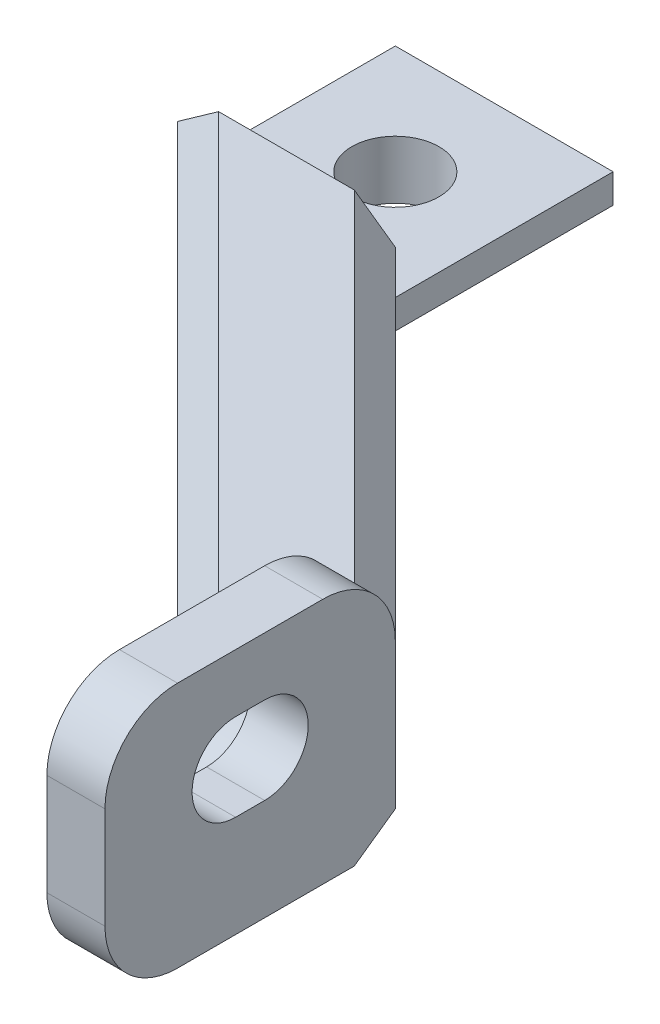
ISO-10303-21;
HEADER;
FILE_DESCRIPTION(('STEP AP214'),'2;1');
FILE_NAME('part.step','',(''),(''),'','','');
FILE_SCHEMA(('AUTOMOTIVE_DESIGN { 1 0 10303 214 1 1 1 1 }'));
ENDSEC;
DATA;
#1=APPLICATION_CONTEXT('core data for automotive mechanical design processes');
#2=APPLICATION_PROTOCOL_DEFINITION('international standard','automotive_design',2000,#1);
#3=PRODUCT_CONTEXT('',#1,'mechanical');
#4=PRODUCT('Part','Part','',(#3));
#5=PRODUCT_RELATED_PRODUCT_CATEGORY('part','',(#4));
#6=PRODUCT_DEFINITION_FORMATION('','',#4);
#7=PRODUCT_DEFINITION_CONTEXT('part definition',#1,'design');
#8=PRODUCT_DEFINITION('design','',#6,#7);
#9=PRODUCT_DEFINITION_SHAPE('','',#8);
#10=(LENGTH_UNIT() NAMED_UNIT(*) SI_UNIT(.MILLI.,.METRE.));
#11=(NAMED_UNIT(*) PLANE_ANGLE_UNIT() SI_UNIT($,.RADIAN.));
#12=(NAMED_UNIT(*) SI_UNIT($,.STERADIAN.) SOLID_ANGLE_UNIT());
#13=UNCERTAINTY_MEASURE_WITH_UNIT(LENGTH_MEASURE(1.E-05),#10,'distance_accuracy_value','');
#14=(GEOMETRIC_REPRESENTATION_CONTEXT(3) GLOBAL_UNCERTAINTY_ASSIGNED_CONTEXT((#13)) GLOBAL_UNIT_ASSIGNED_CONTEXT((#10,
#11,#12)) REPRESENTATION_CONTEXT('',''));
#15=CARTESIAN_POINT('',(0.,0.,0.));
#16=DIRECTION('',(0.,0.,1.));
#17=DIRECTION('',(1.,0.,0.));
#18=AXIS2_PLACEMENT_3D('',#15,#16,#17);
#19=CARTESIAN_POINT('',(-7.5,9.,7.5));
#20=DIRECTION('',(0.707106781186546,0.,-0.707106781186549));
#21=DIRECTION('',(-0.707106781186549,0.,-0.707106781186546));
#22=AXIS2_PLACEMENT_3D('',#19,#20,#21);
#23=PLANE('',#22);
#24=DIRECTION('',(0.,-1.,0.));
#25=VECTOR('',#24,1.);
#26=CARTESIAN_POINT('',(-7.5,9.,7.5));
#27=LINE('',#26,#25);
#28=CARTESIAN_POINT('',(-7.50000000000001,4.,7.5));
#29=VERTEX_POINT('',#28);
#30=CARTESIAN_POINT('',(-7.5,2.00000000000001,7.5));
#31=VERTEX_POINT('',#30);
#32=EDGE_CURVE('E288',#29,#31,#27,.T.);
#33=ORIENTED_EDGE('',*,*,#32,.T.);
#34=DIRECTION('',(0.707106781186549,0.,0.707106781186546));
#35=VECTOR('',#34,1.);
#36=CARTESIAN_POINT('',(-7.5,2.,7.5));
#37=LINE('',#36,#35);
#38=CARTESIAN_POINT('',(32.,2.,46.9999999999999));
#39=VERTEX_POINT('',#38);
#40=EDGE_CURVE('E352',#31,#39,#37,.T.);
#41=ORIENTED_EDGE('',*,*,#40,.T.);
#42=DIRECTION('',(0.,1.,0.));
#43=VECTOR('',#42,1.);
#44=CARTESIAN_POINT('',(32.,9.,46.9999999999999));
#45=LINE('',#44,#43);
#46=CARTESIAN_POINT('',(32.,5.,46.9999999999999));
#47=VERTEX_POINT('',#46);
#48=EDGE_CURVE('E275',#39,#47,#45,.T.);
#49=ORIENTED_EDGE('',*,*,#48,.T.);
#50=DIRECTION('',(0.707106781186549,0.,0.707106781186546));
#51=VECTOR('',#50,1.);
#52=CARTESIAN_POINT('',(-7.5,5.,7.5));
#53=LINE('',#52,#51);
#54=CARTESIAN_POINT('',(30.0000000000001,5.,44.9999999999999));
#55=VERTEX_POINT('',#54);
#56=EDGE_CURVE('E403',#55,#47,#53,.T.);
#57=ORIENTED_EDGE('',*,*,#56,.F.);
#58=CARTESIAN_POINT('',(30.,10.,44.9999999999999));
#59=DIRECTION('',(0.707106781186546,0.,-0.707106781186549));
#60=DIRECTION('',(0.707106781186549,0.,0.707106781186546));
#61=AXIS2_PLACEMENT_3D('',#58,#59,#60);
#62=ELLIPSE('',#61,7.07106781186549,5.);
#63=CARTESIAN_POINT('',(26.,7.,40.9999999999999));
#64=VERTEX_POINT('',#63);
#65=EDGE_CURVE('E410',#64,#55,#62,.F.);
#66=ORIENTED_EDGE('',*,*,#65,.F.);
#67=DIRECTION('',(-0.707106781186549,0.,-0.707106781186546));
#68=VECTOR('',#67,1.);
#69=CARTESIAN_POINT('',(-7.5,7.,7.5));
#70=LINE('',#69,#68);
#71=CARTESIAN_POINT('',(-7.5,7.,7.5));
#72=VERTEX_POINT('',#71);
#73=EDGE_CURVE('E350',#64,#72,#70,.T.);
#74=ORIENTED_EDGE('',*,*,#73,.T.);
#75=EDGE_CURVE('E289',#72,#29,#27,.T.);
#76=ORIENTED_EDGE('',*,*,#75,.T.);
#77=EDGE_LOOP('',(#33,#41,#49,#57,#66,#74,#76));
#78=FACE_BOUND('',#77,.T.);
#79=ADVANCED_FACE('F36',(#78),#23,.F.);
#80=CARTESIAN_POINT('',(7.5,9.,-7.5));
#81=DIRECTION('',(0.,1.,0.));
#82=DIRECTION('',(0.,0.,1.));
#83=AXIS2_PLACEMENT_3D('',#80,#81,#82);
#84=PLANE('',#83);
#85=DIRECTION('',(1.,0.,0.));
#86=VECTOR('',#85,1.);
#87=CARTESIAN_POINT('',(-7.50000000000001,9.,7.5));
#88=LINE('',#87,#86);
#89=CARTESIAN_POINT('',(-4.67157287525382,9.,7.5));
#90=VERTEX_POINT('',#89);
#91=CARTESIAN_POINT('',(4.67157287525381,9.,7.5));
#92=VERTEX_POINT('',#91);
#93=EDGE_CURVE('E244',#90,#92,#88,.T.);
#94=ORIENTED_EDGE('',*,*,#93,.F.);
#95=DIRECTION('',(0.707106781186549,0.,0.707106781186546));
#96=VECTOR('',#95,1.);
#97=CARTESIAN_POINT('',(26.5152340768067,9.,38.6868069520604));
#98=LINE('',#97,#96);
#99=CARTESIAN_POINT('',(27.9294476391799,9.,40.1010205144335));
#100=VERTEX_POINT('',#99);
#101=EDGE_CURVE('E356',#90,#100,#98,.T.);
#102=ORIENTED_EDGE('',*,*,#101,.T.);
#103=DIRECTION('',(1.,0.,0.));
#104=VECTOR('',#103,1.);
#105=CARTESIAN_POINT('',(-7.50000000000002,9.,40.1010205144335));
#106=LINE('',#105,#104);
#107=CARTESIAN_POINT('',(32.,9.,40.1010205144335));
#108=VERTEX_POINT('',#107);
#109=EDGE_CURVE('E408',#100,#108,#106,.T.);
#110=ORIENTED_EDGE('',*,*,#109,.T.);
#111=DIRECTION('',(0.,0.,1.));
#112=VECTOR('',#111,1.);
#113=CARTESIAN_POINT('',(32.,9.,-7.5));
#114=LINE('',#113,#112);
#115=CARTESIAN_POINT('',(32.,9.,35.9999999999999));
#116=VERTEX_POINT('',#115);
#117=EDGE_CURVE('E264',#116,#108,#114,.T.);
#118=ORIENTED_EDGE('',*,*,#117,.F.);
#119=DIRECTION('',(-1.,0.,0.));
#120=VECTOR('',#119,1.);
#121=CARTESIAN_POINT('',(7.5,9.,35.9999999999999));
#122=LINE('',#121,#120);
#123=CARTESIAN_POINT('',(33.1715728752538,9.,35.9999999999999));
#124=VERTEX_POINT('',#123);
#125=EDGE_CURVE('E277',#124,#116,#122,.T.);
#126=ORIENTED_EDGE('',*,*,#125,.F.);
#127=DIRECTION('',(-0.707106781186549,0.,-0.707106781186546));
#128=VECTOR('',#127,1.);
#129=CARTESIAN_POINT('',(6.08578643762691,9.,8.9142135623731));
#130=LINE('',#129,#128);
#131=EDGE_CURVE('E354',#124,#92,#130,.T.);
#132=ORIENTED_EDGE('',*,*,#131,.T.);
#133=EDGE_LOOP('',(#94,#102,#110,#118,#126,#132));
#134=FACE_BOUND('',#133,.T.);
#135=ADVANCED_FACE('F441',(#134),#84,.T.);
#136=CARTESIAN_POINT('',(-7.50000000000002,10.,44.9999999999999));
#137=DIRECTION('',(1.,0.,0.));
#138=DIRECTION('',(0.,0.,-1.));
#139=AXIS2_PLACEMENT_3D('',#136,#137,#138);
#140=CYLINDRICAL_SURFACE('',#139,3.);
#141=CARTESIAN_POINT('',(32.,10.,44.9999999999999));
#142=DIRECTION('',(-1.,0.,0.));
#143=DIRECTION('',(0.,0.,1.));
#144=AXIS2_PLACEMENT_3D('',#141,#142,#143);
#145=CIRCLE('',#144,3.);
#146=CARTESIAN_POINT('',(32.,13.,44.9999999999999));
#147=VERTEX_POINT('',#146);
#148=CARTESIAN_POINT('',(32.,7.00000000000001,44.9999999999999));
#149=VERTEX_POINT('',#148);
#150=EDGE_CURVE('E197',#147,#149,#145,.T.);
#151=ORIENTED_EDGE('',*,*,#150,.T.);
#152=DIRECTION('',(1.,0.,0.));
#153=VECTOR('',#152,1.);
#154=CARTESIAN_POINT('',(-7.50000000000002,7.00000000000001,44.9999999999999));
#155=LINE('',#154,#153);
#156=CARTESIAN_POINT('',(36.,7.00000000000001,44.9999999999999));
#157=VERTEX_POINT('',#156);
#158=EDGE_CURVE('E201',#149,#157,#155,.T.);
#159=ORIENTED_EDGE('',*,*,#158,.T.);
#160=CARTESIAN_POINT('',(36.,10.,44.9999999999999));
#161=DIRECTION('',(1.,0.,0.));
#162=DIRECTION('',(0.,0.,-1.));
#163=AXIS2_PLACEMENT_3D('',#160,#161,#162);
#164=CIRCLE('',#163,3.);
#165=CARTESIAN_POINT('',(36.,13.,44.9999999999999));
#166=VERTEX_POINT('',#165);
#167=EDGE_CURVE('E412',#157,#166,#164,.T.);
#168=ORIENTED_EDGE('',*,*,#167,.T.);
#169=DIRECTION('',(1.,0.,0.));
#170=VECTOR('',#169,1.);
#171=CARTESIAN_POINT('',(-7.50000000000002,13.,44.9999999999999));
#172=LINE('',#171,#170);
#173=EDGE_CURVE('E204',#147,#166,#172,.T.);
#174=ORIENTED_EDGE('',*,*,#173,.F.);
#175=EDGE_LOOP('',(#151,#159,#168,#174));
#176=FACE_BOUND('',#175,.T.);
#177=ADVANCED_FACE('F199',(#176),#140,.F.);
#178=CARTESIAN_POINT('',(-7.50000000000002,7.00000000000001,44.9999999999999));
#179=DIRECTION('',(0.,-1.,0.));
#180=DIRECTION('',(0.,0.,-1.));
#181=AXIS2_PLACEMENT_3D('',#178,#179,#180);
#182=PLANE('',#181);
#183=DIRECTION('',(0.,0.,1.));
#184=VECTOR('',#183,1.);
#185=CARTESIAN_POINT('',(32.,7.00000000000001,46.9999999999999));
#186=LINE('',#185,#184);
#187=CARTESIAN_POINT('',(32.,7.00000000000001,46.9999999999999));
#188=VERTEX_POINT('',#187);
#189=EDGE_CURVE('E211',#149,#188,#186,.T.);
#190=ORIENTED_EDGE('',*,*,#189,.T.);
#191=DIRECTION('',(1.,0.,0.));
#192=VECTOR('',#191,1.);
#193=CARTESIAN_POINT('',(-7.50000000000002,7.00000000000001,46.9999999999999));
#194=LINE('',#193,#192);
#195=CARTESIAN_POINT('',(36.,7.00000000000001,46.9999999999999));
#196=VERTEX_POINT('',#195);
#197=EDGE_CURVE('E224',#188,#196,#194,.T.);
#198=ORIENTED_EDGE('',*,*,#197,.T.);
#199=DIRECTION('',(0.,0.,-1.));
#200=VECTOR('',#199,1.);
#201=CARTESIAN_POINT('',(36.,7.00000000000001,44.9999999999999));
#202=LINE('',#201,#200);
#203=EDGE_CURVE('E221',#196,#157,#202,.T.);
#204=ORIENTED_EDGE('',*,*,#203,.T.);
#205=ORIENTED_EDGE('',*,*,#158,.F.);
#206=EDGE_LOOP('',(#190,#198,#204,#205));
#207=FACE_BOUND('',#206,.T.);
#208=ADVANCED_FACE('F219',(#207),#182,.F.);
#209=CARTESIAN_POINT('',(7.5,9.,-7.5));
#210=DIRECTION('',(-1.,0.,0.));
#211=DIRECTION('',(0.,0.,1.));
#212=AXIS2_PLACEMENT_3D('',#209,#210,#211);
#213=PLANE('',#212);
#214=DIRECTION('',(0.,-1.,0.));
#215=VECTOR('',#214,1.);
#216=CARTESIAN_POINT('',(7.5,9.,7.5));
#217=LINE('',#216,#215);
#218=CARTESIAN_POINT('',(7.5,4.,7.5));
#219=VERTEX_POINT('',#218);
#220=CARTESIAN_POINT('',(7.5,2.00000000000001,7.5));
#221=VERTEX_POINT('',#220);
#222=EDGE_CURVE('E282',#219,#221,#217,.T.);
#223=ORIENTED_EDGE('',*,*,#222,.T.);
#224=DIRECTION('',(0.,0.,-1.));
#225=VECTOR('',#224,1.);
#226=CARTESIAN_POINT('',(7.5,2.00000000000001,-7.5));
#227=LINE('',#226,#225);
#228=CARTESIAN_POINT('',(7.5,2.00000000000001,-7.5));
#229=VERTEX_POINT('',#228);
#230=EDGE_CURVE('E344',#221,#229,#227,.T.);
#231=ORIENTED_EDGE('',*,*,#230,.T.);
#232=DIRECTION('',(0.,-1.,0.));
#233=VECTOR('',#232,1.);
#234=CARTESIAN_POINT('',(7.5,9.,-7.5));
#235=LINE('',#234,#233);
#236=CARTESIAN_POINT('',(7.5,4.,-7.5));
#237=VERTEX_POINT('',#236);
#238=EDGE_CURVE('E294',#237,#229,#235,.T.);
#239=ORIENTED_EDGE('',*,*,#238,.F.);
#240=DIRECTION('',(0.,0.,-1.));
#241=VECTOR('',#240,1.);
#242=CARTESIAN_POINT('',(7.5,4.,7.5));
#243=LINE('',#242,#241);
#244=EDGE_CURVE('E237',#219,#237,#243,.T.);
#245=ORIENTED_EDGE('',*,*,#244,.F.);
#246=EDGE_LOOP('',(#223,#231,#239,#245));
#247=FACE_BOUND('',#246,.T.);
#248=ADVANCED_FACE('F458',(#247),#213,.F.);
#249=CARTESIAN_POINT('',(-7.5,9.,-7.5));
#250=DIRECTION('',(0.,0.,1.));
#251=DIRECTION('',(1.,0.,0.));
#252=AXIS2_PLACEMENT_3D('',#249,#250,#251);
#253=PLANE('',#252);
#254=ORIENTED_EDGE('',*,*,#238,.T.);
#255=DIRECTION('',(-1.,0.,0.));
#256=VECTOR('',#255,1.);
#257=CARTESIAN_POINT('',(-7.5,2.00000000000001,-7.5));
#258=LINE('',#257,#256);
#259=CARTESIAN_POINT('',(-7.5,2.00000000000001,-7.5));
#260=VERTEX_POINT('',#259);
#261=EDGE_CURVE('E346',#229,#260,#258,.T.);
#262=ORIENTED_EDGE('',*,*,#261,.T.);
#263=DIRECTION('',(0.,-1.,0.));
#264=VECTOR('',#263,1.);
#265=CARTESIAN_POINT('',(-7.5,9.,-7.5));
#266=LINE('',#265,#264);
#267=CARTESIAN_POINT('',(-7.50000000000002,4.,-7.49999999999999));
#268=VERTEX_POINT('',#267);
#269=EDGE_CURVE('E291',#268,#260,#266,.T.);
#270=ORIENTED_EDGE('',*,*,#269,.F.);
#271=DIRECTION('',(1.,0.,0.));
#272=VECTOR('',#271,1.);
#273=CARTESIAN_POINT('',(-7.50000000000002,4.,-7.49999999999999));
#274=LINE('',#273,#272);
#275=EDGE_CURVE('E248',#268,#237,#274,.T.);
#276=ORIENTED_EDGE('',*,*,#275,.T.);
#277=EDGE_LOOP('',(#254,#262,#270,#276));
#278=FACE_BOUND('',#277,.T.);
#279=ADVANCED_FACE('F454',(#278),#253,.F.);
#280=CARTESIAN_POINT('',(-7.5,9.,-7.5));
#281=DIRECTION('',(1.,0.,0.));
#282=DIRECTION('',(0.,0.,-1.));
#283=AXIS2_PLACEMENT_3D('',#280,#281,#282);
#284=PLANE('',#283);
#285=ORIENTED_EDGE('',*,*,#269,.T.);
#286=DIRECTION('',(0.,0.,1.));
#287=VECTOR('',#286,1.);
#288=CARTESIAN_POINT('',(-7.5,2.00000000000001,-7.5));
#289=LINE('',#288,#287);
#290=EDGE_CURVE('E348',#260,#31,#289,.T.);
#291=ORIENTED_EDGE('',*,*,#290,.T.);
#292=ORIENTED_EDGE('',*,*,#32,.F.);
#293=DIRECTION('',(0.,0.,-1.));
#294=VECTOR('',#293,1.);
#295=CARTESIAN_POINT('',(-7.50000000000001,4.,7.5));
#296=LINE('',#295,#294);
#297=EDGE_CURVE('E239',#29,#268,#296,.T.);
#298=ORIENTED_EDGE('',*,*,#297,.T.);
#299=EDGE_LOOP('',(#285,#291,#292,#298));
#300=FACE_BOUND('',#299,.T.);
#301=ADVANCED_FACE('F451',(#300),#284,.F.);
#302=CARTESIAN_POINT('',(36.,9.,50.9999999999998));
#303=DIRECTION('',(-1.,0.,0.));
#304=DIRECTION('',(0.,0.,1.));
#305=AXIS2_PLACEMENT_3D('',#302,#303,#304);
#306=PLANE('',#305);
#307=DIRECTION('',(0.,0.,1.));
#308=VECTOR('',#307,1.);
#309=CARTESIAN_POINT('',(36.,13.,44.9999999999999));
#310=LINE('',#309,#308);
#311=CARTESIAN_POINT('',(36.,13.,46.9999999999999));
#312=VERTEX_POINT('',#311);
#313=EDGE_CURVE('E414',#166,#312,#310,.T.);
#314=ORIENTED_EDGE('',*,*,#313,.F.);
#315=ORIENTED_EDGE('',*,*,#167,.F.);
#316=ORIENTED_EDGE('',*,*,#203,.F.);
#317=CARTESIAN_POINT('',(36.,10.,46.9999999999999));
#318=DIRECTION('',(1.,0.,0.));
#319=DIRECTION('',(0.,0.,-1.));
#320=AXIS2_PLACEMENT_3D('',#317,#318,#319);
#321=CIRCLE('',#320,3.);
#322=EDGE_CURVE('E416',#312,#196,#321,.T.);
#323=ORIENTED_EDGE('',*,*,#322,.F.);
#324=EDGE_LOOP('',(#314,#315,#316,#323));
#325=FACE_BOUND('',#324,.T.);
#326=DIRECTION('',(0.,0.,-1.));
#327=VECTOR('',#326,1.);
#328=CARTESIAN_POINT('',(36.,0.,50.9999999999998));
#329=LINE('',#328,#327);
#330=CARTESIAN_POINT('',(36.,0.,50.9999999999999));
#331=VERTEX_POINT('',#330);
#332=CARTESIAN_POINT('',(36.,0.,38.8284271247461));
#333=VERTEX_POINT('',#332);
#334=EDGE_CURVE('E279',#331,#333,#329,.T.);
#335=ORIENTED_EDGE('',*,*,#334,.T.);
#336=DIRECTION('',(0.,-0.577350269189626,0.816496580927726));
#337=VECTOR('',#336,1.);
#338=CARTESIAN_POINT('',(36.,15.4350288425444,17.));
#339=LINE('',#338,#337);
#340=CARTESIAN_POINT('',(36.,2.00000000000001,35.9999999999999));
#341=VERTEX_POINT('',#340);
#342=EDGE_CURVE('E342',#333,#341,#339,.F.);
#343=ORIENTED_EDGE('',*,*,#342,.T.);
#344=DIRECTION('',(0.,-1.,0.));
#345=VECTOR('',#344,1.);
#346=CARTESIAN_POINT('',(36.,9.,35.9999999999999));
#347=LINE('',#346,#345);
#348=CARTESIAN_POINT('',(36.,6.99999999999998,35.9999999999999));
#349=VERTEX_POINT('',#348);
#350=EDGE_CURVE('E285',#349,#341,#347,.T.);
#351=ORIENTED_EDGE('',*,*,#350,.F.);
#352=DIRECTION('',(0.,-1.,0.));
#353=VECTOR('',#352,1.);
#354=CARTESIAN_POINT('',(36.,17.,35.9999999999999));
#355=LINE('',#354,#353);
#356=CARTESIAN_POINT('',(36.,12.,35.9999999999999));
#357=VERTEX_POINT('',#356);
#358=EDGE_CURVE('E261',#357,#349,#355,.T.);
#359=ORIENTED_EDGE('',*,*,#358,.F.);
#360=CARTESIAN_POINT('',(36.,12.,40.9999999999999));
#361=DIRECTION('',(-1.,0.,0.));
#362=DIRECTION('',(0.,0.,1.));
#363=AXIS2_PLACEMENT_3D('',#360,#361,#362);
#364=CIRCLE('',#363,5.);
#365=CARTESIAN_POINT('',(36.,17.,40.9999999999999));
#366=VERTEX_POINT('',#365);
#367=EDGE_CURVE('E306',#357,#366,#364,.F.);
#368=ORIENTED_EDGE('',*,*,#367,.T.);
#369=DIRECTION('',(0.,0.,1.));
#370=VECTOR('',#369,1.);
#371=CARTESIAN_POINT('',(36.,17.,35.9999999999999));
#372=LINE('',#371,#370);
#373=CARTESIAN_POINT('',(36.,17.,50.9999999999999));
#374=VERTEX_POINT('',#373);
#375=EDGE_CURVE('E253',#366,#374,#372,.T.);
#376=ORIENTED_EDGE('',*,*,#375,.T.);
#377=CARTESIAN_POINT('',(36.,12.,50.9999999999999));
#378=DIRECTION('',(-1.,0.,0.));
#379=DIRECTION('',(0.,0.,1.));
#380=AXIS2_PLACEMENT_3D('',#377,#378,#379);
#381=CIRCLE('',#380,5.);
#382=CARTESIAN_POINT('',(36.,12.,55.9999999999999));
#383=VERTEX_POINT('',#382);
#384=EDGE_CURVE('E302',#374,#383,#381,.F.);
#385=ORIENTED_EDGE('',*,*,#384,.T.);
#386=DIRECTION('',(0.,-1.,0.));
#387=VECTOR('',#386,1.);
#388=CARTESIAN_POINT('',(36.,17.,55.9999999999999));
#389=LINE('',#388,#387);
#390=CARTESIAN_POINT('',(36.,5.,55.9999999999999));
#391=VERTEX_POINT('',#390);
#392=EDGE_CURVE('E259',#383,#391,#389,.T.);
#393=ORIENTED_EDGE('',*,*,#392,.T.);
#394=CARTESIAN_POINT('',(36.,5.,50.9999999999999));
#395=DIRECTION('',(-1.,0.,0.));
#396=DIRECTION('',(0.,0.,1.));
#397=AXIS2_PLACEMENT_3D('',#394,#395,#396);
#398=CIRCLE('',#397,5.);
#399=EDGE_CURVE('E304',#391,#331,#398,.F.);
#400=ORIENTED_EDGE('',*,*,#399,.T.);
#401=EDGE_LOOP('',(#335,#343,#351,#359,#368,#376,#385,#393,#400));
#402=FACE_BOUND('',#401,.T.);
#403=ADVANCED_FACE('F423',(#325,#402),#306,.F.);
#404=CARTESIAN_POINT('',(7.5,9.,7.5));
#405=DIRECTION('',(-0.707106781186546,0.,0.707106781186549));
#406=DIRECTION('',(0.707106781186549,0.,0.707106781186546));
#407=AXIS2_PLACEMENT_3D('',#404,#405,#406);
#408=PLANE('',#407);
#409=ORIENTED_EDGE('',*,*,#350,.T.);
#410=DIRECTION('',(-0.707106781186549,0.,-0.707106781186546));
#411=VECTOR('',#410,1.);
#412=CARTESIAN_POINT('',(7.5,2.00000000000001,7.5));
#413=LINE('',#412,#411);
#414=EDGE_CURVE('E329',#341,#221,#413,.T.);
#415=ORIENTED_EDGE('',*,*,#414,.T.);
#416=ORIENTED_EDGE('',*,*,#222,.F.);
#417=CARTESIAN_POINT('',(7.5,6.99999999999998,7.5));
#418=VERTEX_POINT('',#417);
#419=EDGE_CURVE('E283',#418,#219,#217,.T.);
#420=ORIENTED_EDGE('',*,*,#419,.F.);
#421=DIRECTION('',(0.707106781186549,0.,0.707106781186546));
#422=VECTOR('',#421,1.);
#423=CARTESIAN_POINT('',(36.,6.99999999999998,35.9999999999999));
#424=LINE('',#423,#422);
#425=EDGE_CURVE('E326',#418,#349,#424,.T.);
#426=ORIENTED_EDGE('',*,*,#425,.T.);
#427=EDGE_LOOP('',(#409,#415,#416,#420,#426));
#428=FACE_BOUND('',#427,.T.);
#429=ADVANCED_FACE('F515',(#428),#408,.F.);
#430=CARTESIAN_POINT('',(7.5,0.,-7.5));
#431=DIRECTION('',(0.,1.,0.));
#432=DIRECTION('',(0.,0.,1.));
#433=AXIS2_PLACEMENT_3D('',#430,#431,#432);
#434=PLANE('',#433);
#435=CARTESIAN_POINT('',(0.,0.,0.));
#436=DIRECTION('',(0.,1.,0.));
#437=DIRECTION('',(0.,0.,1.));
#438=AXIS2_PLACEMENT_3D('',#435,#436,#437);
#439=CIRCLE('',#438,3.);
#440=CARTESIAN_POINT('',(0.,0.,3.));
#441=VERTEX_POINT('',#440);
#442=EDGE_CURVE('E227',#441,#441,#439,.T.);
#443=ORIENTED_EDGE('',*,*,#442,.T.);
#444=EDGE_LOOP('',(#443));
#445=FACE_BOUND('',#444,.T.);
#446=DIRECTION('',(0.,0.,1.));
#447=VECTOR('',#446,1.);
#448=CARTESIAN_POINT('',(5.49999999999998,0.,-7.5));
#449=LINE('',#448,#447);
#450=CARTESIAN_POINT('',(5.49999999999998,0.,-5.49999999999998));
#451=VERTEX_POINT('',#450);
#452=CARTESIAN_POINT('',(5.49999999999998,0.,8.3284271247462));
#453=VERTEX_POINT('',#452);
#454=EDGE_CURVE('E338',#451,#453,#449,.T.);
#455=ORIENTED_EDGE('',*,*,#454,.T.);
#456=DIRECTION('',(0.707106781186549,0.,0.707106781186546));
#457=VECTOR('',#456,1.);
#458=CARTESIAN_POINT('',(-1.41421356237311,0.,1.41421356237314));
#459=LINE('',#458,#457);
#460=EDGE_CURVE('E340',#453,#333,#459,.T.);
#461=ORIENTED_EDGE('',*,*,#460,.T.);
#462=ORIENTED_EDGE('',*,*,#334,.F.);
#463=DIRECTION('',(-1.,0.,0.));
#464=VECTOR('',#463,1.);
#465=CARTESIAN_POINT('',(32.,0.,50.9999999999999));
#466=LINE('',#465,#464);
#467=CARTESIAN_POINT('',(32.,0.,50.9999999999999));
#468=VERTEX_POINT('',#467);
#469=EDGE_CURVE('E318',#331,#468,#466,.T.);
#470=ORIENTED_EDGE('',*,*,#469,.T.);
#471=DIRECTION('',(0.,0.,-1.));
#472=VECTOR('',#471,1.);
#473=CARTESIAN_POINT('',(32.,0.,35.9999999999999));
#474=LINE('',#473,#472);
#475=CARTESIAN_POINT('',(32.,0.,44.1715728752536));
#476=VERTEX_POINT('',#475);
#477=EDGE_CURVE('E247',#468,#476,#474,.T.);
#478=ORIENTED_EDGE('',*,*,#477,.T.);
#479=DIRECTION('',(-0.707106781186549,0.,-0.707106781186546));
#480=VECTOR('',#479,1.);
#481=CARTESIAN_POINT('',(-6.08578643762687,0.,6.08578643762692));
#482=LINE('',#481,#480);
#483=CARTESIAN_POINT('',(-5.49999999999998,0.,6.6715728752538));
#484=VERTEX_POINT('',#483);
#485=EDGE_CURVE('E332',#476,#484,#482,.T.);
#486=ORIENTED_EDGE('',*,*,#485,.T.);
#487=DIRECTION('',(0.,0.,-1.));
#488=VECTOR('',#487,1.);
#489=CARTESIAN_POINT('',(-5.49999999999999,0.,-7.49999999999999));
#490=LINE('',#489,#488);
#491=CARTESIAN_POINT('',(-5.49999999999998,0.,-5.49999999999998));
#492=VERTEX_POINT('',#491);
#493=EDGE_CURVE('E334',#484,#492,#490,.T.);
#494=ORIENTED_EDGE('',*,*,#493,.T.);
#495=DIRECTION('',(1.,0.,0.));
#496=VECTOR('',#495,1.);
#497=CARTESIAN_POINT('',(7.5,0.,-5.49999999999998));
#498=LINE('',#497,#496);
#499=EDGE_CURVE('E336',#492,#451,#498,.T.);
#500=ORIENTED_EDGE('',*,*,#499,.T.);
#501=EDGE_LOOP('',(#455,#461,#462,#470,#478,#486,#494,#500));
#502=FACE_BOUND('',#501,.T.);
#503=ADVANCED_FACE('F533',(#445,#502),#434,.F.);
#504=CARTESIAN_POINT('',(32.,17.,35.9999999999999));
#505=DIRECTION('',(-1.,0.,0.));
#506=DIRECTION('',(0.,0.,1.));
#507=AXIS2_PLACEMENT_3D('',#504,#505,#506);
#508=PLANE('',#507);
#509=CARTESIAN_POINT('',(32.,10.,46.9999999999999));
#510=DIRECTION('',(-1.,0.,0.));
#511=DIRECTION('',(0.,0.,1.));
#512=AXIS2_PLACEMENT_3D('',#509,#510,#511);
#513=CIRCLE('',#512,3.);
#514=CARTESIAN_POINT('',(32.,13.,46.9999999999999));
#515=VERTEX_POINT('',#514);
#516=EDGE_CURVE('E208',#188,#515,#513,.T.);
#517=ORIENTED_EDGE('',*,*,#516,.F.);
#518=ORIENTED_EDGE('',*,*,#189,.F.);
#519=ORIENTED_EDGE('',*,*,#150,.F.);
#520=DIRECTION('',(0.,0.,-1.));
#521=VECTOR('',#520,1.);
#522=CARTESIAN_POINT('',(32.,13.,35.9999999999999));
#523=LINE('',#522,#521);
#524=EDGE_CURVE('E297',#515,#147,#523,.T.);
#525=ORIENTED_EDGE('',*,*,#524,.F.);
#526=EDGE_LOOP('',(#517,#518,#519,#525));
#527=FACE_BOUND('',#526,.T.);
#528=DIRECTION('',(0.,0.,-1.));
#529=VECTOR('',#528,1.);
#530=CARTESIAN_POINT('',(32.,17.,35.9999999999999));
#531=LINE('',#530,#529);
#532=CARTESIAN_POINT('',(32.,17.,50.9999999999999));
#533=VERTEX_POINT('',#532);
#534=CARTESIAN_POINT('',(32.,17.,40.9999999999999));
#535=VERTEX_POINT('',#534);
#536=EDGE_CURVE('E256',#533,#535,#531,.T.);
#537=ORIENTED_EDGE('',*,*,#536,.T.);
#538=CARTESIAN_POINT('',(32.,12.,40.9999999999999));
#539=DIRECTION('',(-1.,0.,0.));
#540=DIRECTION('',(0.,0.,1.));
#541=AXIS2_PLACEMENT_3D('',#538,#539,#540);
#542=CIRCLE('',#541,5.);
#543=CARTESIAN_POINT('',(32.,12.,35.9999999999999));
#544=VERTEX_POINT('',#543);
#545=EDGE_CURVE('E316',#535,#544,#542,.T.);
#546=ORIENTED_EDGE('',*,*,#545,.T.);
#547=DIRECTION('',(0.,-1.,0.));
#548=VECTOR('',#547,1.);
#549=CARTESIAN_POINT('',(32.,17.,35.9999999999999));
#550=LINE('',#549,#548);
#551=EDGE_CURVE('E265',#544,#116,#550,.T.);
#552=ORIENTED_EDGE('',*,*,#551,.T.);
#553=ORIENTED_EDGE('',*,*,#117,.T.);
#554=CARTESIAN_POINT('',(32.,10.,44.9999999999999));
#555=DIRECTION('',(-1.,0.,0.));
#556=DIRECTION('',(0.,0.,1.));
#557=AXIS2_PLACEMENT_3D('',#554,#555,#556);
#558=CIRCLE('',#557,5.);
#559=CARTESIAN_POINT('',(32.,5.,44.9999999999999));
#560=VERTEX_POINT('',#559);
#561=EDGE_CURVE('E217',#108,#560,#558,.T.);
#562=ORIENTED_EDGE('',*,*,#561,.T.);
#563=DIRECTION('',(0.,0.,1.));
#564=VECTOR('',#563,1.);
#565=CARTESIAN_POINT('',(32.,5.,46.9999999999999));
#566=LINE('',#565,#564);
#567=EDGE_CURVE('E397',#560,#47,#566,.T.);
#568=ORIENTED_EDGE('',*,*,#567,.T.);
#569=ORIENTED_EDGE('',*,*,#48,.F.);
#570=DIRECTION('',(0.,0.577350269189625,0.816496580927727));
#571=VECTOR('',#570,1.);
#572=CARTESIAN_POINT('',(32.,-16.6204785712457,20.6666666666666));
#573=LINE('',#572,#571);
#574=EDGE_CURVE('E46',#39,#476,#573,.F.);
#575=ORIENTED_EDGE('',*,*,#574,.T.);
#576=ORIENTED_EDGE('',*,*,#477,.F.);
#577=CARTESIAN_POINT('',(32.,5.,50.9999999999999));
#578=DIRECTION('',(-1.,0.,0.));
#579=DIRECTION('',(0.,0.,1.));
#580=AXIS2_PLACEMENT_3D('',#577,#578,#579);
#581=CIRCLE('',#580,5.);
#582=CARTESIAN_POINT('',(32.,5.,55.9999999999999));
#583=VERTEX_POINT('',#582);
#584=EDGE_CURVE('E314',#468,#583,#581,.T.);
#585=ORIENTED_EDGE('',*,*,#584,.T.);
#586=DIRECTION('',(0.,-1.,0.));
#587=VECTOR('',#586,1.);
#588=CARTESIAN_POINT('',(32.,17.,55.9999999999999));
#589=LINE('',#588,#587);
#590=CARTESIAN_POINT('',(32.,12.,55.9999999999999));
#591=VERTEX_POINT('',#590);
#592=EDGE_CURVE('E268',#591,#583,#589,.T.);
#593=ORIENTED_EDGE('',*,*,#592,.F.);
#594=CARTESIAN_POINT('',(32.,12.,50.9999999999999));
#595=DIRECTION('',(-1.,0.,0.));
#596=DIRECTION('',(0.,0.,1.));
#597=AXIS2_PLACEMENT_3D('',#594,#595,#596);
#598=CIRCLE('',#597,5.);
#599=EDGE_CURVE('E312',#591,#533,#598,.T.);
#600=ORIENTED_EDGE('',*,*,#599,.T.);
#601=EDGE_LOOP('',(#537,#546,#552,#553,#562,#568,#569,#575,#576,#585,#593,#600));
#602=FACE_BOUND('',#601,.T.);
#603=ADVANCED_FACE('F212',(#527,#602),#508,.T.);
#604=CARTESIAN_POINT('',(36.,17.,35.9999999999999));
#605=DIRECTION('',(0.,0.,-1.));
#606=DIRECTION('',(-1.,0.,0.));
#607=AXIS2_PLACEMENT_3D('',#604,#605,#606);
#608=PLANE('',#607);
#609=ORIENTED_EDGE('',*,*,#551,.F.);
#610=DIRECTION('',(1.,0.,0.));
#611=VECTOR('',#610,1.);
#612=CARTESIAN_POINT('',(36.,12.,35.9999999999999));
#613=LINE('',#612,#611);
#614=EDGE_CURVE('E207',#544,#357,#613,.T.);
#615=ORIENTED_EDGE('',*,*,#614,.T.);
#616=ORIENTED_EDGE('',*,*,#358,.T.);
#617=DIRECTION('',(-0.816496580927725,0.577350269189627,0.));
#618=VECTOR('',#617,1.);
#619=CARTESIAN_POINT('',(10.1143819168359,25.3038960818105,35.9999999999999));
#620=LINE('',#619,#618);
#621=EDGE_CURVE('E12',#349,#124,#620,.T.);
#622=ORIENTED_EDGE('',*,*,#621,.T.);
#623=ORIENTED_EDGE('',*,*,#125,.T.);
#624=EDGE_LOOP('',(#609,#615,#616,#622,#623));
#625=FACE_BOUND('',#624,.T.);
#626=ADVANCED_FACE('F509',(#625),#608,.T.);
#627=CARTESIAN_POINT('',(36.,17.,55.9999999999999));
#628=DIRECTION('',(0.,0.,1.));
#629=DIRECTION('',(1.,0.,0.));
#630=AXIS2_PLACEMENT_3D('',#627,#628,#629);
#631=PLANE('',#630);
#632=ORIENTED_EDGE('',*,*,#592,.T.);
#633=DIRECTION('',(-1.,0.,0.));
#634=VECTOR('',#633,1.);
#635=CARTESIAN_POINT('',(36.,5.,55.9999999999999));
#636=LINE('',#635,#634);
#637=EDGE_CURVE('E324',#583,#391,#636,.F.);
#638=ORIENTED_EDGE('',*,*,#637,.T.);
#639=ORIENTED_EDGE('',*,*,#392,.F.);
#640=DIRECTION('',(-1.,0.,0.));
#641=VECTOR('',#640,1.);
#642=CARTESIAN_POINT('',(32.,12.,55.9999999999999));
#643=LINE('',#642,#641);
#644=EDGE_CURVE('E321',#383,#591,#643,.T.);
#645=ORIENTED_EDGE('',*,*,#644,.T.);
#646=EDGE_LOOP('',(#632,#638,#639,#645));
#647=FACE_BOUND('',#646,.T.);
#648=ADVANCED_FACE('F538',(#647),#631,.T.);
#649=CARTESIAN_POINT('',(36.,17.,55.9999999999999));
#650=DIRECTION('',(0.,-1.,0.));
#651=DIRECTION('',(0.,0.,-1.));
#652=AXIS2_PLACEMENT_3D('',#649,#650,#651);
#653=PLANE('',#652);
#654=ORIENTED_EDGE('',*,*,#375,.F.);
#655=DIRECTION('',(1.,0.,0.));
#656=VECTOR('',#655,1.);
#657=CARTESIAN_POINT('',(32.,17.,40.9999999999999));
#658=LINE('',#657,#656);
#659=EDGE_CURVE('E310',#366,#535,#658,.F.);
#660=ORIENTED_EDGE('',*,*,#659,.T.);
#661=ORIENTED_EDGE('',*,*,#536,.F.);
#662=DIRECTION('',(-1.,0.,0.));
#663=VECTOR('',#662,1.);
#664=CARTESIAN_POINT('',(36.,17.,50.9999999999999));
#665=LINE('',#664,#663);
#666=EDGE_CURVE('E308',#533,#374,#665,.F.);
#667=ORIENTED_EDGE('',*,*,#666,.T.);
#668=EDGE_LOOP('',(#654,#660,#661,#667));
#669=FACE_BOUND('',#668,.T.);
#670=ADVANCED_FACE('F548',(#669),#653,.F.);
#671=CARTESIAN_POINT('',(-7.50000000000001,9.,7.5));
#672=DIRECTION('',(0.,0.,1.));
#673=DIRECTION('',(1.,0.,0.));
#674=AXIS2_PLACEMENT_3D('',#671,#672,#673);
#675=PLANE('',#674);
#676=ORIENTED_EDGE('',*,*,#75,.F.);
#677=DIRECTION('',(0.816496580927724,0.577350269189628,0.));
#678=VECTOR('',#677,1.);
#679=CARTESIAN_POINT('',(-5.61438191683586,8.33333333333334,7.5));
#680=LINE('',#679,#678);
#681=EDGE_CURVE('E362',#72,#90,#680,.T.);
#682=ORIENTED_EDGE('',*,*,#681,.T.);
#683=ORIENTED_EDGE('',*,*,#93,.T.);
#684=DIRECTION('',(0.816496580927725,-0.577350269189628,0.));
#685=VECTOR('',#684,1.);
#686=CARTESIAN_POINT('',(0.614381916835889,11.8688672392661,7.5));
#687=LINE('',#686,#685);
#688=EDGE_CURVE('E54',#92,#418,#687,.T.);
#689=ORIENTED_EDGE('',*,*,#688,.T.);
#690=ORIENTED_EDGE('',*,*,#419,.T.);
#691=DIRECTION('',(1.,0.,0.));
#692=VECTOR('',#691,1.);
#693=CARTESIAN_POINT('',(-7.50000000000001,4.,7.5));
#694=LINE('',#693,#692);
#695=EDGE_CURVE('E242',#29,#219,#694,.T.);
#696=ORIENTED_EDGE('',*,*,#695,.F.);
#697=EDGE_LOOP('',(#676,#682,#683,#689,#690,#696));
#698=FACE_BOUND('',#697,.T.);
#699=ADVANCED_FACE('F501',(#698),#675,.F.);
#700=CARTESIAN_POINT('',(-7.50000000000001,4.,7.5));
#701=DIRECTION('',(0.,-1.,0.));
#702=DIRECTION('',(0.,0.,-1.));
#703=AXIS2_PLACEMENT_3D('',#700,#701,#702);
#704=PLANE('',#703);
#705=CARTESIAN_POINT('',(0.,4.,0.));
#706=DIRECTION('',(0.,1.,0.));
#707=DIRECTION('',(0.,0.,1.));
#708=AXIS2_PLACEMENT_3D('',#705,#706,#707);
#709=CIRCLE('',#708,3.);
#710=CARTESIAN_POINT('',(0.,4.,3.));
#711=VERTEX_POINT('',#710);
#712=EDGE_CURVE('E223',#711,#711,#709,.T.);
#713=ORIENTED_EDGE('',*,*,#712,.F.);
#714=EDGE_LOOP('',(#713));
#715=FACE_BOUND('',#714,.T.);
#716=ORIENTED_EDGE('',*,*,#244,.T.);
#717=ORIENTED_EDGE('',*,*,#275,.F.);
#718=ORIENTED_EDGE('',*,*,#297,.F.);
#719=ORIENTED_EDGE('',*,*,#695,.T.);
#720=EDGE_LOOP('',(#716,#717,#718,#719));
#721=FACE_BOUND('',#720,.T.);
#722=ADVANCED_FACE('F527',(#715,#721),#704,.F.);
#723=CARTESIAN_POINT('',(0.,0.,0.));
#724=DIRECTION('',(0.,1.,0.));
#725=DIRECTION('',(0.,0.,1.));
#726=AXIS2_PLACEMENT_3D('',#723,#724,#725);
#727=CYLINDRICAL_SURFACE('',#726,3.);
#728=ORIENTED_EDGE('',*,*,#442,.F.);
#729=EDGE_LOOP('',(#728));
#730=FACE_BOUND('',#729,.T.);
#731=ORIENTED_EDGE('',*,*,#712,.T.);
#732=EDGE_LOOP('',(#731));
#733=FACE_BOUND('',#732,.T.);
#734=ADVANCED_FACE('F437',(#730,#733),#727,.F.);
#735=CARTESIAN_POINT('',(-7.50000000000002,10.,46.9999999999999));
#736=DIRECTION('',(1.,0.,0.));
#737=DIRECTION('',(0.,0.,-1.));
#738=AXIS2_PLACEMENT_3D('',#735,#736,#737);
#739=CYLINDRICAL_SURFACE('',#738,3.);
#740=ORIENTED_EDGE('',*,*,#516,.T.);
#741=DIRECTION('',(1.,0.,0.));
#742=VECTOR('',#741,1.);
#743=CARTESIAN_POINT('',(-7.50000000000002,13.,46.9999999999999));
#744=LINE('',#743,#742);
#745=EDGE_CURVE('E229',#515,#312,#744,.T.);
#746=ORIENTED_EDGE('',*,*,#745,.T.);
#747=ORIENTED_EDGE('',*,*,#322,.T.);
#748=ORIENTED_EDGE('',*,*,#197,.F.);
#749=EDGE_LOOP('',(#740,#746,#747,#748));
#750=FACE_BOUND('',#749,.T.);
#751=ADVANCED_FACE('F420',(#750),#739,.F.);
#752=CARTESIAN_POINT('',(-7.50000000000002,13.,44.9999999999999));
#753=DIRECTION('',(0.,1.,0.));
#754=DIRECTION('',(0.,0.,1.));
#755=AXIS2_PLACEMENT_3D('',#752,#753,#754);
#756=PLANE('',#755);
#757=ORIENTED_EDGE('',*,*,#524,.T.);
#758=ORIENTED_EDGE('',*,*,#173,.T.);
#759=ORIENTED_EDGE('',*,*,#313,.T.);
#760=ORIENTED_EDGE('',*,*,#745,.F.);
#761=EDGE_LOOP('',(#757,#758,#759,#760));
#762=FACE_BOUND('',#761,.T.);
#763=ADVANCED_FACE('F426',(#762),#756,.F.);
#764=CARTESIAN_POINT('',(-7.50000000000002,10.,44.9999999999999));
#765=DIRECTION('',(1.,0.,0.));
#766=DIRECTION('',(0.,0.,-1.));
#767=AXIS2_PLACEMENT_3D('',#764,#765,#766);
#768=CYLINDRICAL_SURFACE('',#767,5.);
#769=ORIENTED_EDGE('',*,*,#109,.F.);
#770=CARTESIAN_POINT('',(34.2426406871193,10.,44.9999999999999));
#771=DIRECTION('',(-0.500000000000001,0.707106781186544,0.500000000000003));
#772=DIRECTION('',(0.866025403784438,0.408248290463863,0.288675134594816));
#773=AXIS2_PLACEMENT_3D('',#770,#771,#772);
#774=ELLIPSE('',#773,9.99999999999998,5.);
#775=EDGE_CURVE('E359',#100,#64,#774,.T.);
#776=ORIENTED_EDGE('',*,*,#775,.T.);
#777=ORIENTED_EDGE('',*,*,#65,.T.);
#778=DIRECTION('',(1.,0.,0.));
#779=VECTOR('',#778,1.);
#780=CARTESIAN_POINT('',(-7.50000000000002,5.,44.9999999999999));
#781=LINE('',#780,#779);
#782=EDGE_CURVE('E401',#55,#560,#781,.T.);
#783=ORIENTED_EDGE('',*,*,#782,.T.);
#784=ORIENTED_EDGE('',*,*,#561,.F.);
#785=EDGE_LOOP('',(#769,#776,#777,#783,#784));
#786=FACE_BOUND('',#785,.T.);
#787=ADVANCED_FACE('F428',(#786),#768,.F.);
#788=CARTESIAN_POINT('',(-7.50000000000002,5.,46.9999999999999));
#789=DIRECTION('',(0.,1.,0.));
#790=DIRECTION('',(0.,0.,1.));
#791=AXIS2_PLACEMENT_3D('',#788,#789,#790);
#792=PLANE('',#791);
#793=ORIENTED_EDGE('',*,*,#56,.T.);
#794=ORIENTED_EDGE('',*,*,#567,.F.);
#795=ORIENTED_EDGE('',*,*,#782,.F.);
#796=EDGE_LOOP('',(#793,#794,#795));
#797=FACE_BOUND('',#796,.T.);
#798=ADVANCED_FACE('F434',(#797),#792,.T.);
#799=CARTESIAN_POINT('',(36.,12.,40.9999999999999));
#800=DIRECTION('',(-1.,0.,0.));
#801=DIRECTION('',(0.,0.,1.));
#802=AXIS2_PLACEMENT_3D('',#799,#800,#801);
#803=CYLINDRICAL_SURFACE('',#802,5.);
#804=ORIENTED_EDGE('',*,*,#545,.F.);
#805=ORIENTED_EDGE('',*,*,#659,.F.);
#806=ORIENTED_EDGE('',*,*,#367,.F.);
#807=ORIENTED_EDGE('',*,*,#614,.F.);
#808=EDGE_LOOP('',(#804,#805,#806,#807));
#809=FACE_BOUND('',#808,.T.);
#810=ADVANCED_FACE('F463',(#809),#803,.T.);
#811=CARTESIAN_POINT('',(7.5,5.,50.9999999999999));
#812=DIRECTION('',(1.,0.,0.));
#813=DIRECTION('',(0.,0.,-1.));
#814=AXIS2_PLACEMENT_3D('',#811,#812,#813);
#815=CYLINDRICAL_SURFACE('',#814,5.);
#816=ORIENTED_EDGE('',*,*,#399,.F.);
#817=ORIENTED_EDGE('',*,*,#637,.F.);
#818=ORIENTED_EDGE('',*,*,#584,.F.);
#819=ORIENTED_EDGE('',*,*,#469,.F.);
#820=EDGE_LOOP('',(#816,#817,#818,#819));
#821=FACE_BOUND('',#820,.T.);
#822=ADVANCED_FACE('F466',(#821),#815,.T.);
#823=CARTESIAN_POINT('',(36.,12.,50.9999999999999));
#824=DIRECTION('',(1.,0.,0.));
#825=DIRECTION('',(0.,0.,-1.));
#826=AXIS2_PLACEMENT_3D('',#823,#824,#825);
#827=CYLINDRICAL_SURFACE('',#826,5.);
#828=ORIENTED_EDGE('',*,*,#384,.F.);
#829=ORIENTED_EDGE('',*,*,#666,.F.);
#830=ORIENTED_EDGE('',*,*,#599,.F.);
#831=ORIENTED_EDGE('',*,*,#644,.F.);
#832=EDGE_LOOP('',(#828,#829,#830,#831));
#833=FACE_BOUND('',#832,.T.);
#834=ADVANCED_FACE('F470',(#833),#827,.T.);
#835=CARTESIAN_POINT('',(-7.5,2.00000000000001,7.5));
#836=DIRECTION('',(0.499999999999998,0.707106781186549,-0.5));
#837=DIRECTION('',(0.,0.577350269189625,0.816496580927727));
#838=AXIS2_PLACEMENT_3D('',#835,#836,#837);
#839=PLANE('',#838);
#840=ORIENTED_EDGE('',*,*,#574,.F.);
#841=ORIENTED_EDGE('',*,*,#40,.F.);
#842=DIRECTION('',(0.678598344545848,-0.678598344545845,-0.281084637714822));
#843=VECTOR('',#842,1.);
#844=CARTESIAN_POINT('',(-7.5,2.00000000000001,7.5));
#845=LINE('',#844,#843);
#846=EDGE_CURVE('E40',#484,#31,#845,.F.);
#847=ORIENTED_EDGE('',*,*,#846,.F.);
#848=ORIENTED_EDGE('',*,*,#485,.F.);
#849=EDGE_LOOP('',(#840,#841,#847,#848));
#850=FACE_BOUND('',#849,.T.);
#851=ADVANCED_FACE('F386',(#850),#839,.F.);
#852=CARTESIAN_POINT('',(-7.5,2.00000000000001,-7.5));
#853=DIRECTION('',(0.707106781186546,0.707106781186549,0.));
#854=DIRECTION('',(-0.707106781186549,0.707106781186546,0.));
#855=AXIS2_PLACEMENT_3D('',#852,#853,#854);
#856=PLANE('',#855);
#857=ORIENTED_EDGE('',*,*,#846,.T.);
#858=ORIENTED_EDGE('',*,*,#290,.F.);
#859=DIRECTION('',(0.577350269189627,-0.577350269189624,0.577350269189627));
#860=VECTOR('',#859,1.);
#861=CARTESIAN_POINT('',(-7.5,2.00000000000001,-7.5));
#862=LINE('',#861,#860);
#863=EDGE_CURVE('E370',#492,#260,#862,.F.);
#864=ORIENTED_EDGE('',*,*,#863,.F.);
#865=ORIENTED_EDGE('',*,*,#493,.F.);
#866=EDGE_LOOP('',(#857,#858,#864,#865));
#867=FACE_BOUND('',#866,.T.);
#868=ADVANCED_FACE('F381',(#867),#856,.F.);
#869=CARTESIAN_POINT('',(-7.5,2.00000000000001,-7.5));
#870=DIRECTION('',(0.,0.707106781186549,0.707106781186546));
#871=DIRECTION('',(0.,-0.707106781186546,0.707106781186549));
#872=AXIS2_PLACEMENT_3D('',#869,#870,#871);
#873=PLANE('',#872);
#874=ORIENTED_EDGE('',*,*,#863,.T.);
#875=ORIENTED_EDGE('',*,*,#261,.F.);
#876=DIRECTION('',(-0.577350269189627,-0.577350269189624,0.577350269189627));
#877=VECTOR('',#876,1.);
#878=CARTESIAN_POINT('',(2.49999999999998,-2.99999999999998,-2.49999999999998));
#879=LINE('',#878,#877);
#880=EDGE_CURVE('E368',#451,#229,#879,.F.);
#881=ORIENTED_EDGE('',*,*,#880,.F.);
#882=ORIENTED_EDGE('',*,*,#499,.F.);
#883=EDGE_LOOP('',(#874,#875,#881,#882));
#884=FACE_BOUND('',#883,.T.);
#885=ADVANCED_FACE('F483',(#884),#873,.F.);
#886=CARTESIAN_POINT('',(7.5,2.00000000000001,-7.5));
#887=DIRECTION('',(-0.707106781186546,0.707106781186549,0.));
#888=DIRECTION('',(-0.707106781186549,-0.707106781186546,0.));
#889=AXIS2_PLACEMENT_3D('',#886,#887,#888);
#890=PLANE('',#889);
#891=ORIENTED_EDGE('',*,*,#880,.T.);
#892=ORIENTED_EDGE('',*,*,#230,.F.);
#893=DIRECTION('',(-0.678598344545848,-0.678598344545846,0.28108463771482));
#894=VECTOR('',#893,1.);
#895=CARTESIAN_POINT('',(7.5,2.00000000000001,7.5));
#896=LINE('',#895,#894);
#897=EDGE_CURVE('E366',#453,#221,#896,.F.);
#898=ORIENTED_EDGE('',*,*,#897,.F.);
#899=ORIENTED_EDGE('',*,*,#454,.F.);
#900=EDGE_LOOP('',(#891,#892,#898,#899));
#901=FACE_BOUND('',#900,.T.);
#902=ADVANCED_FACE('F479',(#901),#890,.F.);
#903=CARTESIAN_POINT('',(7.5,2.00000000000001,7.5));
#904=DIRECTION('',(-0.499999999999998,0.707106781186548,0.5));
#905=DIRECTION('',(0.,-0.577350269189626,0.816496580927726));
#906=AXIS2_PLACEMENT_3D('',#903,#904,#905);
#907=PLANE('',#906);
#908=ORIENTED_EDGE('',*,*,#342,.F.);
#909=ORIENTED_EDGE('',*,*,#460,.F.);
#910=ORIENTED_EDGE('',*,*,#897,.T.);
#911=ORIENTED_EDGE('',*,*,#414,.F.);
#912=EDGE_LOOP('',(#908,#909,#910,#911));
#913=FACE_BOUND('',#912,.T.);
#914=ADVANCED_FACE('F475',(#913),#907,.F.);
#915=CARTESIAN_POINT('',(-6.08578643762689,9.,6.08578643762694));
#916=DIRECTION('',(-0.500000000000001,0.707106781186544,0.500000000000003));
#917=DIRECTION('',(0.,-0.57735026918963,0.816496580927723));
#918=AXIS2_PLACEMENT_3D('',#915,#916,#917);
#919=PLANE('',#918);
#920=ORIENTED_EDGE('',*,*,#681,.F.);
#921=ORIENTED_EDGE('',*,*,#73,.F.);
#922=ORIENTED_EDGE('',*,*,#775,.F.);
#923=ORIENTED_EDGE('',*,*,#101,.F.);
#924=EDGE_LOOP('',(#920,#921,#922,#923));
#925=FACE_BOUND('',#924,.T.);
#926=ADVANCED_FACE('F478',(#925),#919,.T.);
#927=CARTESIAN_POINT('',(-1.41421356237309,9.,1.41421356237312));
#928=DIRECTION('',(0.500000000000001,0.707106781186545,-0.500000000000002));
#929=DIRECTION('',(0.,0.577350269189629,0.816496580927724));
#930=AXIS2_PLACEMENT_3D('',#927,#928,#929);
#931=PLANE('',#930);
#932=ORIENTED_EDGE('',*,*,#621,.F.);
#933=ORIENTED_EDGE('',*,*,#425,.F.);
#934=ORIENTED_EDGE('',*,*,#688,.F.);
#935=ORIENTED_EDGE('',*,*,#131,.F.);
#936=EDGE_LOOP('',(#932,#933,#934,#935));
#937=FACE_BOUND('',#936,.T.);
#938=ADVANCED_FACE('F38',(#937),#931,.T.);
#939=CLOSED_SHELL('',(#79,#135,#177,#208,#248,#279,#301,#403,#429,#503,#603,#626,#648,#670,#699,
#722,#734,#751,#763,#787,#798,#810,#822,#834,#851,#868,#885,#902,#914,#926,#938));
#940=MANIFOLD_SOLID_BREP('B2',#939);
#941=ADVANCED_BREP_SHAPE_REPRESENTATION('',(#18,#940),#14);
#942=SHAPE_DEFINITION_REPRESENTATION(#9,#941);
ENDSEC;
END-ISO-10303-21;
